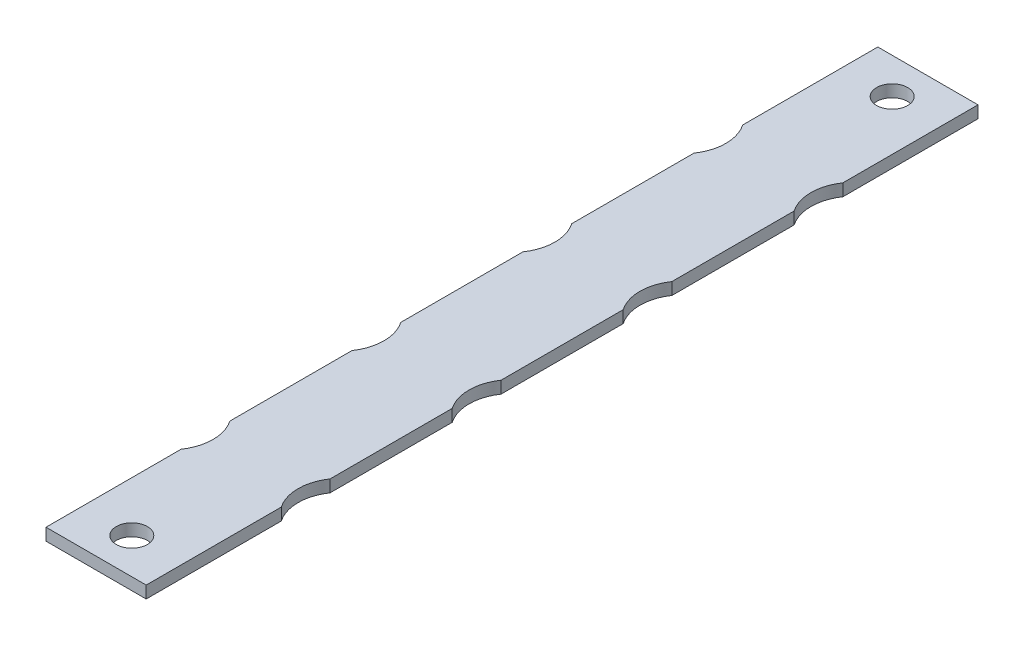
ISO-10303-21;
HEADER;
FILE_DESCRIPTION(('STEP AP214'),'2;1');
FILE_NAME('part.step','',(''),(''),'','','');
FILE_SCHEMA(('AUTOMOTIVE_DESIGN { 1 0 10303 214 1 1 1 1 }'));
ENDSEC;
DATA;
#1=APPLICATION_CONTEXT('core data for automotive mechanical design processes');
#2=APPLICATION_PROTOCOL_DEFINITION('international standard','automotive_design',2000,#1);
#3=PRODUCT_CONTEXT('',#1,'mechanical');
#4=PRODUCT('Part','Part','',(#3));
#5=PRODUCT_RELATED_PRODUCT_CATEGORY('part','',(#4));
#6=PRODUCT_DEFINITION_FORMATION('','',#4);
#7=PRODUCT_DEFINITION_CONTEXT('part definition',#1,'design');
#8=PRODUCT_DEFINITION('design','',#6,#7);
#9=PRODUCT_DEFINITION_SHAPE('','',#8);
#10=(LENGTH_UNIT() NAMED_UNIT(*) SI_UNIT(.MILLI.,.METRE.));
#11=(NAMED_UNIT(*) PLANE_ANGLE_UNIT() SI_UNIT($,.RADIAN.));
#12=(NAMED_UNIT(*) SI_UNIT($,.STERADIAN.) SOLID_ANGLE_UNIT());
#13=UNCERTAINTY_MEASURE_WITH_UNIT(LENGTH_MEASURE(1.E-05),#10,'distance_accuracy_value','');
#14=(GEOMETRIC_REPRESENTATION_CONTEXT(3) GLOBAL_UNCERTAINTY_ASSIGNED_CONTEXT((#13)) GLOBAL_UNIT_ASSIGNED_CONTEXT((#10,
#11,#12)) REPRESENTATION_CONTEXT('',''));
#15=CARTESIAN_POINT('',(0.,0.,0.));
#16=DIRECTION('',(0.,0.,1.));
#17=DIRECTION('',(1.,0.,0.));
#18=AXIS2_PLACEMENT_3D('',#15,#16,#17);
#19=CARTESIAN_POINT('',(0.,1.6002,0.));
#20=DIRECTION('',(-1.,0.,0.));
#21=DIRECTION('',(0.,0.,1.));
#22=AXIS2_PLACEMENT_3D('',#19,#20,#21);
#23=PLANE('',#22);
#24=DIRECTION('',(0.,1.,0.));
#25=VECTOR('',#24,1.);
#26=CARTESIAN_POINT('',(0.,0.,-63.0788855533007));
#27=LINE('',#26,#25);
#28=CARTESIAN_POINT('',(0.,0.,-63.0788855533007));
#29=VERTEX_POINT('',#28);
#30=CARTESIAN_POINT('',(0.,1.6002,-63.0788855533007));
#31=VERTEX_POINT('',#30);
#32=EDGE_CURVE('E260',#29,#31,#27,.T.);
#33=ORIENTED_EDGE('',*,*,#32,.F.);
#34=DIRECTION('',(0.,0.,-1.));
#35=VECTOR('',#34,1.);
#36=CARTESIAN_POINT('',(0.,0.,0.));
#37=LINE('',#36,#35);
#38=CARTESIAN_POINT('',(0.,0.,-46.9226917506993));
#39=VERTEX_POINT('',#38);
#40=EDGE_CURVE('E200',#39,#29,#37,.T.);
#41=ORIENTED_EDGE('',*,*,#40,.F.);
#42=DIRECTION('',(0.,1.,0.));
#43=VECTOR('',#42,1.);
#44=CARTESIAN_POINT('',(0.,0.,-46.9226917506993));
#45=LINE('',#44,#43);
#46=CARTESIAN_POINT('',(0.,1.6002,-46.9226917506993));
#47=VERTEX_POINT('',#46);
#48=EDGE_CURVE('E273',#47,#39,#45,.F.);
#49=ORIENTED_EDGE('',*,*,#48,.F.);
#50=DIRECTION('',(0.,0.,-1.));
#51=VECTOR('',#50,1.);
#52=CARTESIAN_POINT('',(0.,1.6002,0.));
#53=LINE('',#52,#51);
#54=EDGE_CURVE('E350',#47,#31,#53,.T.);
#55=ORIENTED_EDGE('',*,*,#54,.T.);
#56=EDGE_LOOP('',(#33,#41,#49,#55));
#57=FACE_BOUND('',#56,.T.);
#58=ADVANCED_FACE('F36',(#57),#23,.T.);
#59=DIRECTION('',(0.,1.,0.));
#60=VECTOR('',#59,1.);
#61=CARTESIAN_POINT('',(0.,0.,-40.4728855533007));
#62=LINE('',#61,#60);
#63=CARTESIAN_POINT('',(0.,0.,-40.4728855533007));
#64=VERTEX_POINT('',#63);
#65=CARTESIAN_POINT('',(0.,1.6002,-40.4728855533007));
#66=VERTEX_POINT('',#65);
#67=EDGE_CURVE('E271',#64,#66,#62,.T.);
#68=ORIENTED_EDGE('',*,*,#67,.F.);
#69=CARTESIAN_POINT('',(0.,0.,-24.3166917506993));
#70=VERTEX_POINT('',#69);
#71=EDGE_CURVE('E203',#70,#64,#37,.T.);
#72=ORIENTED_EDGE('',*,*,#71,.F.);
#73=DIRECTION('',(0.,1.,0.));
#74=VECTOR('',#73,1.);
#75=CARTESIAN_POINT('',(0.,0.,-24.3166917506993));
#76=LINE('',#75,#74);
#77=CARTESIAN_POINT('',(0.,1.6002,-24.3166917506993));
#78=VERTEX_POINT('',#77);
#79=EDGE_CURVE('E277',#78,#70,#76,.F.);
#80=ORIENTED_EDGE('',*,*,#79,.F.);
#81=EDGE_CURVE('E253',#78,#66,#53,.T.);
#82=ORIENTED_EDGE('',*,*,#81,.T.);
#83=EDGE_LOOP('',(#68,#72,#80,#82));
#84=FACE_BOUND('',#83,.T.);
#85=ADVANCED_FACE('F361',(#84),#23,.T.);
#86=DIRECTION('',(0.,1.,0.));
#87=VECTOR('',#86,1.);
#88=CARTESIAN_POINT('',(0.,0.,-17.8668855533007));
#89=LINE('',#88,#87);
#90=CARTESIAN_POINT('',(0.,0.,-17.8668855533007));
#91=VERTEX_POINT('',#90);
#92=CARTESIAN_POINT('',(0.,1.6002,-17.8668855533007));
#93=VERTEX_POINT('',#92);
#94=EDGE_CURVE('E275',#91,#93,#89,.T.);
#95=ORIENTED_EDGE('',*,*,#94,.F.);
#96=CARTESIAN_POINT('',(0.,0.,0.));
#97=VERTEX_POINT('',#96);
#98=EDGE_CURVE('E205',#97,#91,#37,.T.);
#99=ORIENTED_EDGE('',*,*,#98,.F.);
#100=DIRECTION('',(0.,-1.,0.));
#101=VECTOR('',#100,1.);
#102=CARTESIAN_POINT('',(0.,1.6002,0.));
#103=LINE('',#102,#101);
#104=CARTESIAN_POINT('',(0.,1.6002,0.));
#105=VERTEX_POINT('',#104);
#106=EDGE_CURVE('E11',#105,#97,#103,.T.);
#107=ORIENTED_EDGE('',*,*,#106,.F.);
#108=EDGE_CURVE('E251',#105,#93,#53,.T.);
#109=ORIENTED_EDGE('',*,*,#108,.T.);
#110=EDGE_LOOP('',(#95,#99,#107,#109));
#111=FACE_BOUND('',#110,.T.);
#112=ADVANCED_FACE('F376',(#111),#23,.T.);
#113=DIRECTION('',(0.,1.,0.));
#114=VECTOR('',#113,1.);
#115=CARTESIAN_POINT('',(0.,0.,-69.5286917506993));
#116=LINE('',#115,#114);
#117=CARTESIAN_POINT('',(0.,1.6002,-69.5286917506993));
#118=VERTEX_POINT('',#117);
#119=CARTESIAN_POINT('',(0.,0.,-69.5286917506993));
#120=VERTEX_POINT('',#119);
#121=EDGE_CURVE('E269',#118,#120,#116,.F.);
#122=ORIENTED_EDGE('',*,*,#121,.F.);
#123=CARTESIAN_POINT('',(0.,1.6002,-85.6848855533008));
#124=VERTEX_POINT('',#123);
#125=EDGE_CURVE('E192',#118,#124,#53,.T.);
#126=ORIENTED_EDGE('',*,*,#125,.T.);
#127=DIRECTION('',(0.,1.,0.));
#128=VECTOR('',#127,1.);
#129=CARTESIAN_POINT('',(0.,0.,-85.6848855533008));
#130=LINE('',#129,#128);
#131=CARTESIAN_POINT('',(0.,0.,-85.6848855533008));
#132=VERTEX_POINT('',#131);
#133=EDGE_CURVE('E176',#132,#124,#130,.T.);
#134=ORIENTED_EDGE('',*,*,#133,.F.);
#135=EDGE_CURVE('E190',#120,#132,#37,.T.);
#136=ORIENTED_EDGE('',*,*,#135,.F.);
#137=EDGE_LOOP('',(#122,#126,#134,#136));
#138=FACE_BOUND('',#137,.T.);
#139=ADVANCED_FACE('F189',(#138),#23,.T.);
#140=CARTESIAN_POINT('',(13.25,1.6002,0.));
#141=DIRECTION('',(-1.,0.,0.));
#142=DIRECTION('',(0.,0.,1.));
#143=AXIS2_PLACEMENT_3D('',#140,#141,#142);
#144=PLANE('',#143);
#145=DIRECTION('',(0.,0.,-1.));
#146=VECTOR('',#145,1.);
#147=CARTESIAN_POINT('',(13.25,0.,0.));
#148=LINE('',#147,#146);
#149=CARTESIAN_POINT('',(13.25,0.,0.));
#150=VERTEX_POINT('',#149);
#151=CARTESIAN_POINT('',(13.25,0.,-17.8668855533007));
#152=VERTEX_POINT('',#151);
#153=EDGE_CURVE('E215',#150,#152,#148,.T.);
#154=ORIENTED_EDGE('',*,*,#153,.T.);
#155=DIRECTION('',(0.,1.,0.));
#156=VECTOR('',#155,1.);
#157=CARTESIAN_POINT('',(13.25,0.,-17.8668855533007));
#158=LINE('',#157,#156);
#159=CARTESIAN_POINT('',(13.25,1.6002,-17.8668855533007));
#160=VERTEX_POINT('',#159);
#161=EDGE_CURVE('E279',#152,#160,#158,.T.);
#162=ORIENTED_EDGE('',*,*,#161,.T.);
#163=DIRECTION('',(0.,0.,-1.));
#164=VECTOR('',#163,1.);
#165=CARTESIAN_POINT('',(13.25,1.6002,0.));
#166=LINE('',#165,#164);
#167=CARTESIAN_POINT('',(13.25,1.6002,0.));
#168=VERTEX_POINT('',#167);
#169=EDGE_CURVE('E232',#168,#160,#166,.T.);
#170=ORIENTED_EDGE('',*,*,#169,.F.);
#171=DIRECTION('',(0.,-1.,0.));
#172=VECTOR('',#171,1.);
#173=CARTESIAN_POINT('',(13.25,1.6002,0.));
#174=LINE('',#173,#172);
#175=EDGE_CURVE('E45',#168,#150,#174,.T.);
#176=ORIENTED_EDGE('',*,*,#175,.T.);
#177=EDGE_LOOP('',(#154,#162,#170,#176));
#178=FACE_BOUND('',#177,.T.);
#179=ADVANCED_FACE('F381',(#178),#144,.F.);
#180=CARTESIAN_POINT('',(13.25,1.6002,-24.3166917506993));
#181=VERTEX_POINT('',#180);
#182=CARTESIAN_POINT('',(13.25,1.6002,-40.4728855533007));
#183=VERTEX_POINT('',#182);
#184=EDGE_CURVE('E238',#181,#183,#166,.T.);
#185=ORIENTED_EDGE('',*,*,#184,.F.);
#186=DIRECTION('',(0.,1.,0.));
#187=VECTOR('',#186,1.);
#188=CARTESIAN_POINT('',(13.25,0.,-24.3166917506993));
#189=LINE('',#188,#187);
#190=CARTESIAN_POINT('',(13.25,0.,-24.3166917506993));
#191=VERTEX_POINT('',#190);
#192=EDGE_CURVE('E282',#181,#191,#189,.F.);
#193=ORIENTED_EDGE('',*,*,#192,.T.);
#194=CARTESIAN_POINT('',(13.25,0.,-40.4728855533007));
#195=VERTEX_POINT('',#194);
#196=EDGE_CURVE('E219',#191,#195,#148,.T.);
#197=ORIENTED_EDGE('',*,*,#196,.T.);
#198=DIRECTION('',(0.,1.,0.));
#199=VECTOR('',#198,1.);
#200=CARTESIAN_POINT('',(13.25,0.,-40.4728855533007));
#201=LINE('',#200,#199);
#202=EDGE_CURVE('E285',#195,#183,#201,.T.);
#203=ORIENTED_EDGE('',*,*,#202,.T.);
#204=EDGE_LOOP('',(#185,#193,#197,#203));
#205=FACE_BOUND('',#204,.T.);
#206=ADVANCED_FACE('F338',(#205),#144,.F.);
#207=CARTESIAN_POINT('',(13.25,1.6002,-46.9226917506993));
#208=VERTEX_POINT('',#207);
#209=CARTESIAN_POINT('',(13.25,1.6002,-63.0788855533007));
#210=VERTEX_POINT('',#209);
#211=EDGE_CURVE('E243',#208,#210,#166,.T.);
#212=ORIENTED_EDGE('',*,*,#211,.F.);
#213=DIRECTION('',(0.,1.,0.));
#214=VECTOR('',#213,1.);
#215=CARTESIAN_POINT('',(13.25,0.,-46.9226917506993));
#216=LINE('',#215,#214);
#217=CARTESIAN_POINT('',(13.25,0.,-46.9226917506993));
#218=VERTEX_POINT('',#217);
#219=EDGE_CURVE('E288',#208,#218,#216,.F.);
#220=ORIENTED_EDGE('',*,*,#219,.T.);
#221=CARTESIAN_POINT('',(13.25,0.,-63.0788855533007));
#222=VERTEX_POINT('',#221);
#223=EDGE_CURVE('E334',#218,#222,#148,.T.);
#224=ORIENTED_EDGE('',*,*,#223,.T.);
#225=DIRECTION('',(0.,1.,0.));
#226=VECTOR('',#225,1.);
#227=CARTESIAN_POINT('',(13.25,0.,-63.0788855533007));
#228=LINE('',#227,#226);
#229=EDGE_CURVE('E61',#222,#210,#228,.T.);
#230=ORIENTED_EDGE('',*,*,#229,.T.);
#231=EDGE_LOOP('',(#212,#220,#224,#230));
#232=FACE_BOUND('',#231,.T.);
#233=ADVANCED_FACE('F388',(#232),#144,.F.);
#234=CARTESIAN_POINT('',(13.25,1.6002,-69.5286917506993));
#235=VERTEX_POINT('',#234);
#236=CARTESIAN_POINT('',(13.25,1.6002,-85.6848855533008));
#237=VERTEX_POINT('',#236);
#238=EDGE_CURVE('E245',#235,#237,#166,.T.);
#239=ORIENTED_EDGE('',*,*,#238,.F.);
#240=DIRECTION('',(0.,1.,0.));
#241=VECTOR('',#240,1.);
#242=CARTESIAN_POINT('',(13.25,0.,-69.5286917506993));
#243=LINE('',#242,#241);
#244=CARTESIAN_POINT('',(13.25,0.,-69.5286917506993));
#245=VERTEX_POINT('',#244);
#246=EDGE_CURVE('E292',#235,#245,#243,.F.);
#247=ORIENTED_EDGE('',*,*,#246,.T.);
#248=CARTESIAN_POINT('',(13.25,0.,-85.6848855533008));
#249=VERTEX_POINT('',#248);
#250=EDGE_CURVE('E339',#245,#249,#148,.T.);
#251=ORIENTED_EDGE('',*,*,#250,.T.);
#252=DIRECTION('',(0.,1.,0.));
#253=VECTOR('',#252,1.);
#254=CARTESIAN_POINT('',(13.25,0.,-85.6848855533008));
#255=LINE('',#254,#253);
#256=EDGE_CURVE('E53',#249,#237,#255,.T.);
#257=ORIENTED_EDGE('',*,*,#256,.T.);
#258=EDGE_LOOP('',(#239,#247,#251,#257));
#259=FACE_BOUND('',#258,.T.);
#260=ADVANCED_FACE('F405',(#259),#144,.F.);
#261=DIRECTION('',(0.,1.,0.));
#262=VECTOR('',#261,1.);
#263=CARTESIAN_POINT('',(0.,0.,-92.1346917506992));
#264=LINE('',#263,#262);
#265=CARTESIAN_POINT('',(0.,1.6002,-92.1346917506992));
#266=VERTEX_POINT('',#265);
#267=CARTESIAN_POINT('',(0.,0.,-92.1346917506992));
#268=VERTEX_POINT('',#267);
#269=EDGE_CURVE('E179',#266,#268,#264,.F.);
#270=ORIENTED_EDGE('',*,*,#269,.F.);
#271=CARTESIAN_POINT('',(0.,1.6002,-110.001600164));
#272=VERTEX_POINT('',#271);
#273=EDGE_CURVE('E220',#266,#272,#53,.T.);
#274=ORIENTED_EDGE('',*,*,#273,.T.);
#275=DIRECTION('',(0.,-1.,0.));
#276=VECTOR('',#275,1.);
#277=CARTESIAN_POINT('',(0.,1.6002,-110.001600164));
#278=LINE('',#277,#276);
#279=CARTESIAN_POINT('',(0.,0.,-110.001600164));
#280=VERTEX_POINT('',#279);
#281=EDGE_CURVE('E40',#272,#280,#278,.T.);
#282=ORIENTED_EDGE('',*,*,#281,.T.);
#283=EDGE_CURVE('E201',#268,#280,#37,.T.);
#284=ORIENTED_EDGE('',*,*,#283,.F.);
#285=EDGE_LOOP('',(#270,#274,#282,#284));
#286=FACE_BOUND('',#285,.T.);
#287=ADVANCED_FACE('F38',(#286),#23,.T.);
#288=CARTESIAN_POINT('',(0.,1.6002,0.));
#289=DIRECTION('',(0.,0.,-1.));
#290=DIRECTION('',(-1.,0.,0.));
#291=AXIS2_PLACEMENT_3D('',#288,#289,#290);
#292=PLANE('',#291);
#293=DIRECTION('',(1.,0.,0.));
#294=VECTOR('',#293,1.);
#295=CARTESIAN_POINT('',(0.,0.,0.));
#296=LINE('',#295,#294);
#297=EDGE_CURVE('E218',#97,#150,#296,.T.);
#298=ORIENTED_EDGE('',*,*,#297,.T.);
#299=ORIENTED_EDGE('',*,*,#175,.F.);
#300=DIRECTION('',(1.,0.,0.));
#301=VECTOR('',#300,1.);
#302=CARTESIAN_POINT('',(0.,1.6002,0.));
#303=LINE('',#302,#301);
#304=EDGE_CURVE('E210',#105,#168,#303,.T.);
#305=ORIENTED_EDGE('',*,*,#304,.F.);
#306=ORIENTED_EDGE('',*,*,#106,.T.);
#307=EDGE_LOOP('',(#298,#299,#305,#306));
#308=FACE_BOUND('',#307,.T.);
#309=ADVANCED_FACE('F378',(#308),#292,.F.);
#310=CARTESIAN_POINT('',(13.25,1.6002,-92.1346917506992));
#311=VERTEX_POINT('',#310);
#312=CARTESIAN_POINT('',(13.25,1.6002,-110.001600164));
#313=VERTEX_POINT('',#312);
#314=EDGE_CURVE('E239',#311,#313,#166,.T.);
#315=ORIENTED_EDGE('',*,*,#314,.F.);
#316=DIRECTION('',(0.,1.,0.));
#317=VECTOR('',#316,1.);
#318=CARTESIAN_POINT('',(13.25,0.,-92.1346917506992));
#319=LINE('',#318,#317);
#320=CARTESIAN_POINT('',(13.25,0.,-92.1346917506992));
#321=VERTEX_POINT('',#320);
#322=EDGE_CURVE('E193',#311,#321,#319,.F.);
#323=ORIENTED_EDGE('',*,*,#322,.T.);
#324=CARTESIAN_POINT('',(13.25,0.,-110.001600164));
#325=VERTEX_POINT('',#324);
#326=EDGE_CURVE('E214',#321,#325,#148,.T.);
#327=ORIENTED_EDGE('',*,*,#326,.T.);
#328=DIRECTION('',(0.,-1.,0.));
#329=VECTOR('',#328,1.);
#330=CARTESIAN_POINT('',(13.25,1.6002,-110.001600164));
#331=LINE('',#330,#329);
#332=EDGE_CURVE('E223',#313,#325,#331,.T.);
#333=ORIENTED_EDGE('',*,*,#332,.F.);
#334=EDGE_LOOP('',(#315,#323,#327,#333));
#335=FACE_BOUND('',#334,.T.);
#336=ADVANCED_FACE('F346',(#335),#144,.F.);
#337=CARTESIAN_POINT('',(0.,1.6002,-110.001600164));
#338=DIRECTION('',(0.,0.,-1.));
#339=DIRECTION('',(-1.,0.,0.));
#340=AXIS2_PLACEMENT_3D('',#337,#338,#339);
#341=PLANE('',#340);
#342=DIRECTION('',(1.,0.,0.));
#343=VECTOR('',#342,1.);
#344=CARTESIAN_POINT('',(0.,0.,-110.001600164));
#345=LINE('',#344,#343);
#346=EDGE_CURVE('E209',#280,#325,#345,.T.);
#347=ORIENTED_EDGE('',*,*,#346,.F.);
#348=ORIENTED_EDGE('',*,*,#281,.F.);
#349=DIRECTION('',(1.,0.,0.));
#350=VECTOR('',#349,1.);
#351=CARTESIAN_POINT('',(0.,1.6002,-110.001600164));
#352=LINE('',#351,#350);
#353=EDGE_CURVE('E246',#272,#313,#352,.T.);
#354=ORIENTED_EDGE('',*,*,#353,.T.);
#355=ORIENTED_EDGE('',*,*,#332,.T.);
#356=EDGE_LOOP('',(#347,#348,#354,#355));
#357=FACE_BOUND('',#356,.T.);
#358=ADVANCED_FACE('F347',(#357),#341,.T.);
#359=CARTESIAN_POINT('',(0.,1.6002,0.));
#360=DIRECTION('',(0.,-1.,0.));
#361=DIRECTION('',(0.,0.,-1.));
#362=AXIS2_PLACEMENT_3D('',#359,#360,#361);
#363=PLANE('',#362);
#364=CARTESIAN_POINT('',(6.625,1.6002,-4.7244));
#365=DIRECTION('',(0.,1.,0.));
#366=DIRECTION('',(0.,0.,1.));
#367=AXIS2_PLACEMENT_3D('',#364,#365,#366);
#368=CIRCLE('',#367,2.0574);
#369=CARTESIAN_POINT('',(6.625,1.6002,-2.667));
#370=VERTEX_POINT('',#369);
#371=EDGE_CURVE('E263',#370,#370,#368,.T.);
#372=ORIENTED_EDGE('',*,*,#371,.F.);
#373=EDGE_LOOP('',(#372));
#374=FACE_BOUND('',#373,.T.);
#375=CARTESIAN_POINT('',(6.625,1.6002,-105.277200164));
#376=DIRECTION('',(0.,1.,0.));
#377=DIRECTION('',(0.,0.,1.));
#378=AXIS2_PLACEMENT_3D('',#375,#376,#377);
#379=CIRCLE('',#378,2.0574);
#380=CARTESIAN_POINT('',(6.625,1.6002,-103.219800164));
#381=VERTEX_POINT('',#380);
#382=EDGE_CURVE('E256',#381,#381,#379,.T.);
#383=ORIENTED_EDGE('',*,*,#382,.F.);
#384=EDGE_LOOP('',(#383));
#385=FACE_BOUND('',#384,.T.);
#386=ORIENTED_EDGE('',*,*,#125,.F.);
#387=CARTESIAN_POINT('',(-4.69999999799999,1.6002,-66.303788652));
#388=DIRECTION('',(0.,1.,0.));
#389=DIRECTION('',(0.,0.,1.));
#390=AXIS2_PLACEMENT_3D('',#387,#388,#389);
#391=CIRCLE('',#390,5.699999998);
#392=EDGE_CURVE('E316',#31,#118,#391,.T.);
#393=ORIENTED_EDGE('',*,*,#392,.F.);
#394=ORIENTED_EDGE('',*,*,#54,.F.);
#395=CARTESIAN_POINT('',(-4.69999999799999,1.6002,-43.697788652));
#396=DIRECTION('',(0.,1.,0.));
#397=DIRECTION('',(0.,0.,1.));
#398=AXIS2_PLACEMENT_3D('',#395,#396,#397);
#399=CIRCLE('',#398,5.699999998);
#400=EDGE_CURVE('E311',#66,#47,#399,.T.);
#401=ORIENTED_EDGE('',*,*,#400,.F.);
#402=ORIENTED_EDGE('',*,*,#81,.F.);
#403=CARTESIAN_POINT('',(-4.69999999799999,1.6002,-21.091788652));
#404=DIRECTION('',(0.,1.,0.));
#405=DIRECTION('',(0.,0.,1.));
#406=AXIS2_PLACEMENT_3D('',#403,#404,#405);
#407=CIRCLE('',#406,5.699999998);
#408=EDGE_CURVE('E306',#93,#78,#407,.T.);
#409=ORIENTED_EDGE('',*,*,#408,.F.);
#410=ORIENTED_EDGE('',*,*,#108,.F.);
#411=ORIENTED_EDGE('',*,*,#304,.T.);
#412=ORIENTED_EDGE('',*,*,#169,.T.);
#413=CARTESIAN_POINT('',(17.949999998,1.6002,-21.091788652));
#414=DIRECTION('',(0.,1.,0.));
#415=DIRECTION('',(0.,0.,-1.));
#416=AXIS2_PLACEMENT_3D('',#413,#414,#415);
#417=CIRCLE('',#416,5.699999998);
#418=EDGE_CURVE('E300',#181,#160,#417,.T.);
#419=ORIENTED_EDGE('',*,*,#418,.F.);
#420=ORIENTED_EDGE('',*,*,#184,.T.);
#421=CARTESIAN_POINT('',(17.949999998,1.6002,-43.697788652));
#422=DIRECTION('',(0.,1.,0.));
#423=DIRECTION('',(0.,0.,-1.));
#424=AXIS2_PLACEMENT_3D('',#421,#422,#423);
#425=CIRCLE('',#424,5.699999998);
#426=EDGE_CURVE('E327',#208,#183,#425,.T.);
#427=ORIENTED_EDGE('',*,*,#426,.F.);
#428=ORIENTED_EDGE('',*,*,#211,.T.);
#429=CARTESIAN_POINT('',(17.949999998,1.6002,-66.303788652));
#430=DIRECTION('',(0.,1.,0.));
#431=DIRECTION('',(0.,0.,-1.));
#432=AXIS2_PLACEMENT_3D('',#429,#430,#431);
#433=CIRCLE('',#432,5.699999998);
#434=EDGE_CURVE('E323',#235,#210,#433,.T.);
#435=ORIENTED_EDGE('',*,*,#434,.F.);
#436=ORIENTED_EDGE('',*,*,#238,.T.);
#437=CARTESIAN_POINT('',(17.949999998,1.6002,-88.909788652));
#438=DIRECTION('',(0.,1.,0.));
#439=DIRECTION('',(0.,0.,-1.));
#440=AXIS2_PLACEMENT_3D('',#437,#438,#439);
#441=CIRCLE('',#440,5.699999998);
#442=EDGE_CURVE('E319',#311,#237,#441,.T.);
#443=ORIENTED_EDGE('',*,*,#442,.F.);
#444=ORIENTED_EDGE('',*,*,#314,.T.);
#445=ORIENTED_EDGE('',*,*,#353,.F.);
#446=ORIENTED_EDGE('',*,*,#273,.F.);
#447=CARTESIAN_POINT('',(-4.699999998,1.6002,-88.909788652));
#448=DIRECTION('',(0.,1.,0.));
#449=DIRECTION('',(0.,0.,1.));
#450=AXIS2_PLACEMENT_3D('',#447,#448,#449);
#451=CIRCLE('',#450,5.699999998);
#452=EDGE_CURVE('E183',#124,#266,#451,.T.);
#453=ORIENTED_EDGE('',*,*,#452,.F.);
#454=EDGE_LOOP('',(#386,#393,#394,#401,#402,#409,#410,#411,#412,#419,#420,#427,#428,#435,#436,
#443,#444,#445,#446,#453));
#455=FACE_BOUND('',#454,.T.);
#456=ADVANCED_FACE('F349',(#374,#385,#455),#363,.F.);
#457=CARTESIAN_POINT('',(0.,0.,0.));
#458=DIRECTION('',(0.,-1.,0.));
#459=DIRECTION('',(0.,0.,-1.));
#460=AXIS2_PLACEMENT_3D('',#457,#458,#459);
#461=PLANE('',#460);
#462=CARTESIAN_POINT('',(-4.69999999799999,0.,-66.303788652));
#463=DIRECTION('',(0.,1.,0.));
#464=DIRECTION('',(0.,0.,1.));
#465=AXIS2_PLACEMENT_3D('',#462,#463,#464);
#466=CIRCLE('',#465,5.699999998);
#467=EDGE_CURVE('E199',#29,#120,#466,.T.);
#468=ORIENTED_EDGE('',*,*,#467,.T.);
#469=ORIENTED_EDGE('',*,*,#135,.T.);
#470=CARTESIAN_POINT('',(-4.699999998,0.,-88.909788652));
#471=DIRECTION('',(0.,1.,0.));
#472=DIRECTION('',(0.,0.,1.));
#473=AXIS2_PLACEMENT_3D('',#470,#471,#472);
#474=CIRCLE('',#473,5.699999998);
#475=EDGE_CURVE('E173',#132,#268,#474,.T.);
#476=ORIENTED_EDGE('',*,*,#475,.T.);
#477=ORIENTED_EDGE('',*,*,#283,.T.);
#478=ORIENTED_EDGE('',*,*,#346,.T.);
#479=ORIENTED_EDGE('',*,*,#326,.F.);
#480=CARTESIAN_POINT('',(17.949999998,0.,-88.909788652));
#481=DIRECTION('',(0.,1.,0.));
#482=DIRECTION('',(0.,0.,-1.));
#483=AXIS2_PLACEMENT_3D('',#480,#481,#482);
#484=CIRCLE('',#483,5.699999998);
#485=EDGE_CURVE('E321',#321,#249,#484,.T.);
#486=ORIENTED_EDGE('',*,*,#485,.T.);
#487=ORIENTED_EDGE('',*,*,#250,.F.);
#488=CARTESIAN_POINT('',(17.949999998,0.,-66.303788652));
#489=DIRECTION('',(0.,1.,0.));
#490=DIRECTION('',(0.,0.,-1.));
#491=AXIS2_PLACEMENT_3D('',#488,#489,#490);
#492=CIRCLE('',#491,5.699999998);
#493=EDGE_CURVE('E325',#245,#222,#492,.T.);
#494=ORIENTED_EDGE('',*,*,#493,.T.);
#495=ORIENTED_EDGE('',*,*,#223,.F.);
#496=CARTESIAN_POINT('',(17.949999998,0.,-43.697788652));
#497=DIRECTION('',(0.,1.,0.));
#498=DIRECTION('',(0.,0.,-1.));
#499=AXIS2_PLACEMENT_3D('',#496,#497,#498);
#500=CIRCLE('',#499,5.699999998);
#501=EDGE_CURVE('E303',#218,#195,#500,.T.);
#502=ORIENTED_EDGE('',*,*,#501,.T.);
#503=ORIENTED_EDGE('',*,*,#196,.F.);
#504=CARTESIAN_POINT('',(17.949999998,0.,-21.091788652));
#505=DIRECTION('',(0.,1.,0.));
#506=DIRECTION('',(0.,0.,-1.));
#507=AXIS2_PLACEMENT_3D('',#504,#505,#506);
#508=CIRCLE('',#507,5.699999998);
#509=EDGE_CURVE('E302',#191,#152,#508,.T.);
#510=ORIENTED_EDGE('',*,*,#509,.T.);
#511=ORIENTED_EDGE('',*,*,#153,.F.);
#512=ORIENTED_EDGE('',*,*,#297,.F.);
#513=ORIENTED_EDGE('',*,*,#98,.T.);
#514=CARTESIAN_POINT('',(-4.69999999799999,0.,-21.091788652));
#515=DIRECTION('',(0.,1.,0.));
#516=DIRECTION('',(0.,0.,1.));
#517=AXIS2_PLACEMENT_3D('',#514,#515,#516);
#518=CIRCLE('',#517,5.699999998);
#519=EDGE_CURVE('E308',#91,#70,#518,.T.);
#520=ORIENTED_EDGE('',*,*,#519,.T.);
#521=ORIENTED_EDGE('',*,*,#71,.T.);
#522=CARTESIAN_POINT('',(-4.69999999799999,0.,-43.697788652));
#523=DIRECTION('',(0.,1.,0.));
#524=DIRECTION('',(0.,0.,1.));
#525=AXIS2_PLACEMENT_3D('',#522,#523,#524);
#526=CIRCLE('',#525,5.699999998);
#527=EDGE_CURVE('E313',#64,#39,#526,.T.);
#528=ORIENTED_EDGE('',*,*,#527,.T.);
#529=ORIENTED_EDGE('',*,*,#40,.T.);
#530=EDGE_LOOP('',(#468,#469,#476,#477,#478,#479,#486,#487,#494,#495,#502,#503,#510,#511,#512,
#513,#520,#521,#528,#529));
#531=FACE_BOUND('',#530,.T.);
#532=CARTESIAN_POINT('',(6.625,0.,-4.7244));
#533=DIRECTION('',(0.,1.,0.));
#534=DIRECTION('',(0.,0.,1.));
#535=AXIS2_PLACEMENT_3D('',#532,#533,#534);
#536=CIRCLE('',#535,2.0574);
#537=CARTESIAN_POINT('',(6.625,0.,-2.667));
#538=VERTEX_POINT('',#537);
#539=EDGE_CURVE('E204',#538,#538,#536,.T.);
#540=ORIENTED_EDGE('',*,*,#539,.T.);
#541=EDGE_LOOP('',(#540));
#542=FACE_BOUND('',#541,.T.);
#543=CARTESIAN_POINT('',(6.625,0.,-105.277200164));
#544=DIRECTION('',(0.,1.,0.));
#545=DIRECTION('',(0.,0.,1.));
#546=AXIS2_PLACEMENT_3D('',#543,#544,#545);
#547=CIRCLE('',#546,2.0574);
#548=CARTESIAN_POINT('',(6.625,0.,-103.219800164));
#549=VERTEX_POINT('',#548);
#550=EDGE_CURVE('E259',#549,#549,#547,.T.);
#551=ORIENTED_EDGE('',*,*,#550,.T.);
#552=EDGE_LOOP('',(#551));
#553=FACE_BOUND('',#552,.T.);
#554=ADVANCED_FACE('F196',(#531,#542,#553),#461,.T.);
#555=CARTESIAN_POINT('',(6.625,0.,-105.277200164));
#556=DIRECTION('',(0.,1.,0.));
#557=DIRECTION('',(0.,0.,1.));
#558=AXIS2_PLACEMENT_3D('',#555,#556,#557);
#559=CYLINDRICAL_SURFACE('',#558,2.0574);
#560=ORIENTED_EDGE('',*,*,#550,.F.);
#561=EDGE_LOOP('',(#560));
#562=FACE_BOUND('',#561,.T.);
#563=ORIENTED_EDGE('',*,*,#382,.T.);
#564=EDGE_LOOP('',(#563));
#565=FACE_BOUND('',#564,.T.);
#566=ADVANCED_FACE('F438',(#562,#565),#559,.F.);
#567=CARTESIAN_POINT('',(6.625,0.,-4.7244));
#568=DIRECTION('',(0.,1.,0.));
#569=DIRECTION('',(0.,0.,1.));
#570=AXIS2_PLACEMENT_3D('',#567,#568,#569);
#571=CYLINDRICAL_SURFACE('',#570,2.0574);
#572=ORIENTED_EDGE('',*,*,#539,.F.);
#573=EDGE_LOOP('',(#572));
#574=FACE_BOUND('',#573,.T.);
#575=ORIENTED_EDGE('',*,*,#371,.T.);
#576=EDGE_LOOP('',(#575));
#577=FACE_BOUND('',#576,.T.);
#578=ADVANCED_FACE('F433',(#574,#577),#571,.F.);
#579=CARTESIAN_POINT('',(-4.699999998,0.,-88.909788652));
#580=DIRECTION('',(0.,1.,0.));
#581=DIRECTION('',(0.,0.,1.));
#582=AXIS2_PLACEMENT_3D('',#579,#580,#581);
#583=CYLINDRICAL_SURFACE('',#582,5.699999998);
#584=ORIENTED_EDGE('',*,*,#133,.T.);
#585=ORIENTED_EDGE('',*,*,#452,.T.);
#586=ORIENTED_EDGE('',*,*,#269,.T.);
#587=ORIENTED_EDGE('',*,*,#475,.F.);
#588=EDGE_LOOP('',(#584,#585,#586,#587));
#589=FACE_BOUND('',#588,.T.);
#590=ADVANCED_FACE('F175',(#589),#583,.F.);
#591=CARTESIAN_POINT('',(17.949999998,0.,-88.909788652));
#592=DIRECTION('',(0.,1.,0.));
#593=DIRECTION('',(0.,0.,1.));
#594=AXIS2_PLACEMENT_3D('',#591,#592,#593);
#595=CYLINDRICAL_SURFACE('',#594,5.699999998);
#596=ORIENTED_EDGE('',*,*,#485,.F.);
#597=ORIENTED_EDGE('',*,*,#322,.F.);
#598=ORIENTED_EDGE('',*,*,#442,.T.);
#599=ORIENTED_EDGE('',*,*,#256,.F.);
#600=EDGE_LOOP('',(#596,#597,#598,#599));
#601=FACE_BOUND('',#600,.T.);
#602=ADVANCED_FACE('F398',(#601),#595,.F.);
#603=CARTESIAN_POINT('',(17.949999998,0.,-66.303788652));
#604=DIRECTION('',(0.,1.,0.));
#605=DIRECTION('',(0.,0.,1.));
#606=AXIS2_PLACEMENT_3D('',#603,#604,#605);
#607=CYLINDRICAL_SURFACE('',#606,5.699999998);
#608=ORIENTED_EDGE('',*,*,#493,.F.);
#609=ORIENTED_EDGE('',*,*,#246,.F.);
#610=ORIENTED_EDGE('',*,*,#434,.T.);
#611=ORIENTED_EDGE('',*,*,#229,.F.);
#612=EDGE_LOOP('',(#608,#609,#610,#611));
#613=FACE_BOUND('',#612,.T.);
#614=ADVANCED_FACE('F391',(#613),#607,.F.);
#615=CARTESIAN_POINT('',(17.949999998,0.,-43.697788652));
#616=DIRECTION('',(0.,1.,0.));
#617=DIRECTION('',(0.,0.,1.));
#618=AXIS2_PLACEMENT_3D('',#615,#616,#617);
#619=CYLINDRICAL_SURFACE('',#618,5.699999998);
#620=ORIENTED_EDGE('',*,*,#501,.F.);
#621=ORIENTED_EDGE('',*,*,#219,.F.);
#622=ORIENTED_EDGE('',*,*,#426,.T.);
#623=ORIENTED_EDGE('',*,*,#202,.F.);
#624=EDGE_LOOP('',(#620,#621,#622,#623));
#625=FACE_BOUND('',#624,.T.);
#626=ADVANCED_FACE('F389',(#625),#619,.F.);
#627=CARTESIAN_POINT('',(17.949999998,0.,-21.091788652));
#628=DIRECTION('',(0.,1.,0.));
#629=DIRECTION('',(0.,0.,1.));
#630=AXIS2_PLACEMENT_3D('',#627,#628,#629);
#631=CYLINDRICAL_SURFACE('',#630,5.699999998);
#632=ORIENTED_EDGE('',*,*,#509,.F.);
#633=ORIENTED_EDGE('',*,*,#192,.F.);
#634=ORIENTED_EDGE('',*,*,#418,.T.);
#635=ORIENTED_EDGE('',*,*,#161,.F.);
#636=EDGE_LOOP('',(#632,#633,#634,#635));
#637=FACE_BOUND('',#636,.T.);
#638=ADVANCED_FACE('F383',(#637),#631,.F.);
#639=CARTESIAN_POINT('',(-4.69999999799999,0.,-21.091788652));
#640=DIRECTION('',(0.,1.,0.));
#641=DIRECTION('',(0.,0.,1.));
#642=AXIS2_PLACEMENT_3D('',#639,#640,#641);
#643=CYLINDRICAL_SURFACE('',#642,5.699999998);
#644=ORIENTED_EDGE('',*,*,#94,.T.);
#645=ORIENTED_EDGE('',*,*,#408,.T.);
#646=ORIENTED_EDGE('',*,*,#79,.T.);
#647=ORIENTED_EDGE('',*,*,#519,.F.);
#648=EDGE_LOOP('',(#644,#645,#646,#647));
#649=FACE_BOUND('',#648,.T.);
#650=ADVANCED_FACE('F374',(#649),#643,.F.);
#651=CARTESIAN_POINT('',(-4.69999999799999,0.,-43.697788652));
#652=DIRECTION('',(0.,1.,0.));
#653=DIRECTION('',(0.,0.,1.));
#654=AXIS2_PLACEMENT_3D('',#651,#652,#653);
#655=CYLINDRICAL_SURFACE('',#654,5.699999998);
#656=ORIENTED_EDGE('',*,*,#67,.T.);
#657=ORIENTED_EDGE('',*,*,#400,.T.);
#658=ORIENTED_EDGE('',*,*,#48,.T.);
#659=ORIENTED_EDGE('',*,*,#527,.F.);
#660=EDGE_LOOP('',(#656,#657,#658,#659));
#661=FACE_BOUND('',#660,.T.);
#662=ADVANCED_FACE('F368',(#661),#655,.F.);
#663=CARTESIAN_POINT('',(-4.69999999799999,0.,-66.303788652));
#664=DIRECTION('',(0.,1.,0.));
#665=DIRECTION('',(0.,0.,1.));
#666=AXIS2_PLACEMENT_3D('',#663,#664,#665);
#667=CYLINDRICAL_SURFACE('',#666,5.699999998);
#668=ORIENTED_EDGE('',*,*,#32,.T.);
#669=ORIENTED_EDGE('',*,*,#392,.T.);
#670=ORIENTED_EDGE('',*,*,#121,.T.);
#671=ORIENTED_EDGE('',*,*,#467,.F.);
#672=EDGE_LOOP('',(#668,#669,#670,#671));
#673=FACE_BOUND('',#672,.T.);
#674=ADVANCED_FACE('F537',(#673),#667,.F.);
#675=CLOSED_SHELL('',(#58,#85,#112,#139,#179,#206,#233,#260,#287,#309,#336,#358,#456,#554,#566,
#578,#590,#602,#614,#626,#638,#650,#662,#674));
#676=MANIFOLD_SOLID_BREP('B2',#675);
#677=ADVANCED_BREP_SHAPE_REPRESENTATION('',(#18,#676),#14);
#678=SHAPE_DEFINITION_REPRESENTATION(#9,#677);
ENDSEC;
END-ISO-10303-21;
